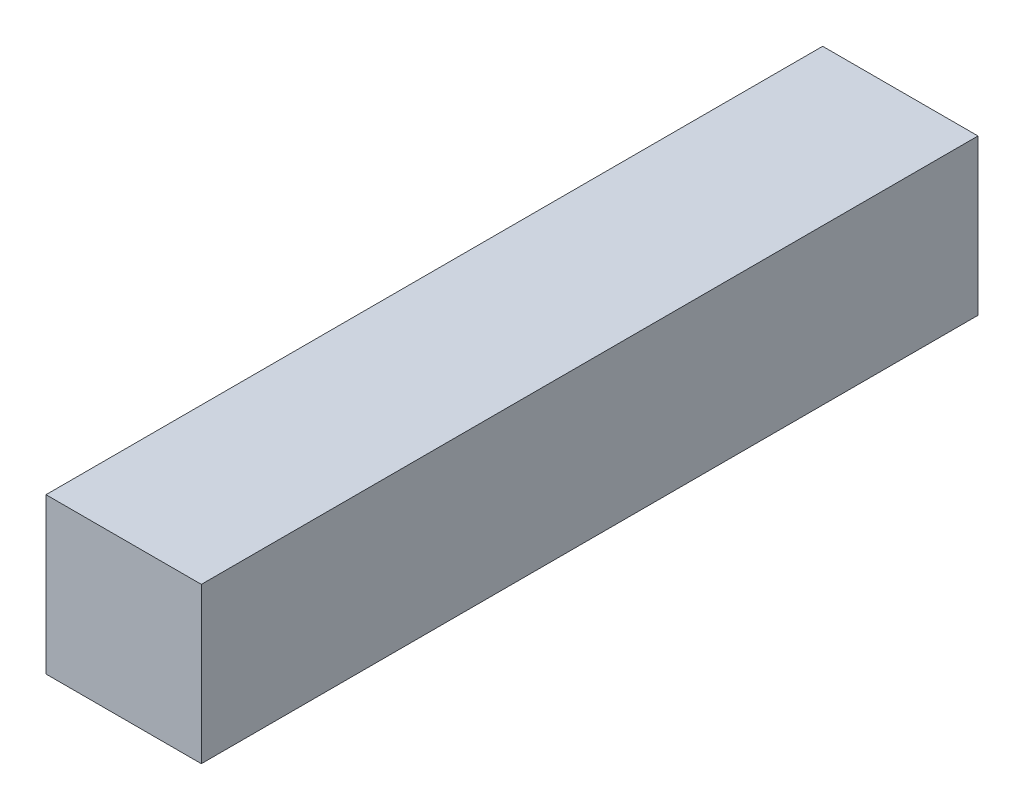
ISO-10303-21;
HEADER;
FILE_DESCRIPTION(('STEP AP214'),'2;1');
FILE_NAME('part.step','',(''),(''),'','','');
FILE_SCHEMA(('AUTOMOTIVE_DESIGN { 1 0 10303 214 1 1 1 1 }'));
ENDSEC;
DATA;
#1=APPLICATION_CONTEXT('core data for automotive mechanical design processes');
#2=APPLICATION_PROTOCOL_DEFINITION('international standard','automotive_design',2000,#1);
#3=PRODUCT_CONTEXT('',#1,'mechanical');
#4=PRODUCT('Part','Part','',(#3));
#5=PRODUCT_RELATED_PRODUCT_CATEGORY('part','',(#4));
#6=PRODUCT_DEFINITION_FORMATION('','',#4);
#7=PRODUCT_DEFINITION_CONTEXT('part definition',#1,'design');
#8=PRODUCT_DEFINITION('design','',#6,#7);
#9=PRODUCT_DEFINITION_SHAPE('','',#8);
#10=(LENGTH_UNIT() NAMED_UNIT(*) SI_UNIT(.MILLI.,.METRE.));
#11=(NAMED_UNIT(*) PLANE_ANGLE_UNIT() SI_UNIT($,.RADIAN.));
#12=(NAMED_UNIT(*) SI_UNIT($,.STERADIAN.) SOLID_ANGLE_UNIT());
#13=UNCERTAINTY_MEASURE_WITH_UNIT(LENGTH_MEASURE(1.E-05),#10,'distance_accuracy_value','');
#14=(GEOMETRIC_REPRESENTATION_CONTEXT(3) GLOBAL_UNCERTAINTY_ASSIGNED_CONTEXT((#13)) GLOBAL_UNIT_ASSIGNED_CONTEXT((#10,
#11,#12)) REPRESENTATION_CONTEXT('',''));
#15=CARTESIAN_POINT('',(0.,0.,0.));
#16=DIRECTION('',(0.,0.,1.));
#17=DIRECTION('',(1.,0.,0.));
#18=AXIS2_PLACEMENT_3D('',#15,#16,#17);
#19=CARTESIAN_POINT('',(0.,0.,-200000.));
#20=DIRECTION('',(-1.,0.,0.));
#21=DIRECTION('',(0.,0.,1.));
#22=AXIS2_PLACEMENT_3D('',#19,#20,#21);
#23=PLANE('',#22);
#24=DIRECTION('',(0.,-1.,0.));
#25=VECTOR('',#24,1.);
#26=CARTESIAN_POINT('',(0.,0.,0.));
#27=LINE('',#26,#25);
#28=CARTESIAN_POINT('',(0.,40000.,0.));
#29=VERTEX_POINT('',#28);
#30=CARTESIAN_POINT('',(0.,0.,0.));
#31=VERTEX_POINT('',#30);
#32=EDGE_CURVE('E104',#29,#31,#27,.T.);
#33=ORIENTED_EDGE('',*,*,#32,.F.);
#34=DIRECTION('',(0.,0.,1.));
#35=VECTOR('',#34,1.);
#36=CARTESIAN_POINT('',(0.,40000.,-200000.));
#37=LINE('',#36,#35);
#38=CARTESIAN_POINT('',(0.,40000.,-200000.));
#39=VERTEX_POINT('',#38);
#40=EDGE_CURVE('E11',#39,#29,#37,.T.);
#41=ORIENTED_EDGE('',*,*,#40,.F.);
#42=DIRECTION('',(0.,-1.,0.));
#43=VECTOR('',#42,1.);
#44=CARTESIAN_POINT('',(0.,0.,-200000.));
#45=LINE('',#44,#43);
#46=CARTESIAN_POINT('',(0.,0.,-200000.));
#47=VERTEX_POINT('',#46);
#48=EDGE_CURVE('E97',#39,#47,#45,.T.);
#49=ORIENTED_EDGE('',*,*,#48,.T.);
#50=DIRECTION('',(0.,0.,1.));
#51=VECTOR('',#50,1.);
#52=CARTESIAN_POINT('',(0.,0.,-200000.));
#53=LINE('',#52,#51);
#54=EDGE_CURVE('E42',#47,#31,#53,.T.);
#55=ORIENTED_EDGE('',*,*,#54,.T.);
#56=EDGE_LOOP('',(#33,#41,#49,#55));
#57=FACE_BOUND('',#56,.T.);
#58=ADVANCED_FACE('F41',(#57),#23,.T.);
#59=CARTESIAN_POINT('',(0.,40000.,-200000.));
#60=DIRECTION('',(0.,1.,0.));
#61=DIRECTION('',(0.,0.,1.));
#62=AXIS2_PLACEMENT_3D('',#59,#60,#61);
#63=PLANE('',#62);
#64=DIRECTION('',(-1.,0.,0.));
#65=VECTOR('',#64,1.);
#66=CARTESIAN_POINT('',(0.,40000.,0.));
#67=LINE('',#66,#65);
#68=CARTESIAN_POINT('',(40000.,40000.,0.));
#69=VERTEX_POINT('',#68);
#70=EDGE_CURVE('E101',#69,#29,#67,.T.);
#71=ORIENTED_EDGE('',*,*,#70,.F.);
#72=DIRECTION('',(0.,0.,1.));
#73=VECTOR('',#72,1.);
#74=CARTESIAN_POINT('',(40000.,40000.,-200000.));
#75=LINE('',#74,#73);
#76=CARTESIAN_POINT('',(40000.,40000.,-200000.));
#77=VERTEX_POINT('',#76);
#78=EDGE_CURVE('E49',#77,#69,#75,.T.);
#79=ORIENTED_EDGE('',*,*,#78,.F.);
#80=DIRECTION('',(-1.,0.,0.));
#81=VECTOR('',#80,1.);
#82=CARTESIAN_POINT('',(0.,40000.,-200000.));
#83=LINE('',#82,#81);
#84=EDGE_CURVE('E96',#77,#39,#83,.T.);
#85=ORIENTED_EDGE('',*,*,#84,.T.);
#86=ORIENTED_EDGE('',*,*,#40,.T.);
#87=EDGE_LOOP('',(#71,#79,#85,#86));
#88=FACE_BOUND('',#87,.T.);
#89=ADVANCED_FACE('F113',(#88),#63,.T.);
#90=CARTESIAN_POINT('',(40000.,0.,-200000.));
#91=DIRECTION('',(1.,0.,0.));
#92=DIRECTION('',(0.,0.,-1.));
#93=AXIS2_PLACEMENT_3D('',#90,#91,#92);
#94=PLANE('',#93);
#95=DIRECTION('',(0.,1.,0.));
#96=VECTOR('',#95,1.);
#97=CARTESIAN_POINT('',(40000.,0.,0.));
#98=LINE('',#97,#96);
#99=CARTESIAN_POINT('',(40000.,0.,0.));
#100=VERTEX_POINT('',#99);
#101=EDGE_CURVE('E93',#100,#69,#98,.T.);
#102=ORIENTED_EDGE('',*,*,#101,.F.);
#103=DIRECTION('',(0.,0.,1.));
#104=VECTOR('',#103,1.);
#105=CARTESIAN_POINT('',(40000.,0.,-200000.));
#106=LINE('',#105,#104);
#107=CARTESIAN_POINT('',(40000.,0.,-200000.));
#108=VERTEX_POINT('',#107);
#109=EDGE_CURVE('E88',#108,#100,#106,.T.);
#110=ORIENTED_EDGE('',*,*,#109,.F.);
#111=DIRECTION('',(0.,1.,0.));
#112=VECTOR('',#111,1.);
#113=CARTESIAN_POINT('',(40000.,0.,-200000.));
#114=LINE('',#113,#112);
#115=EDGE_CURVE('E90',#108,#77,#114,.T.);
#116=ORIENTED_EDGE('',*,*,#115,.T.);
#117=ORIENTED_EDGE('',*,*,#78,.T.);
#118=EDGE_LOOP('',(#102,#110,#116,#117));
#119=FACE_BOUND('',#118,.T.);
#120=ADVANCED_FACE('F86',(#119),#94,.T.);
#121=CARTESIAN_POINT('',(0.,0.,-200000.));
#122=DIRECTION('',(0.,-1.,0.));
#123=DIRECTION('',(0.,0.,-1.));
#124=AXIS2_PLACEMENT_3D('',#121,#122,#123);
#125=PLANE('',#124);
#126=DIRECTION('',(1.,0.,0.));
#127=VECTOR('',#126,1.);
#128=CARTESIAN_POINT('',(0.,0.,0.));
#129=LINE('',#128,#127);
#130=EDGE_CURVE('E107',#31,#100,#129,.T.);
#131=ORIENTED_EDGE('',*,*,#130,.F.);
#132=ORIENTED_EDGE('',*,*,#54,.F.);
#133=DIRECTION('',(1.,0.,0.));
#134=VECTOR('',#133,1.);
#135=CARTESIAN_POINT('',(0.,0.,-200000.));
#136=LINE('',#135,#134);
#137=EDGE_CURVE('E92',#47,#108,#136,.T.);
#138=ORIENTED_EDGE('',*,*,#137,.T.);
#139=ORIENTED_EDGE('',*,*,#109,.T.);
#140=EDGE_LOOP('',(#131,#132,#138,#139));
#141=FACE_BOUND('',#140,.T.);
#142=ADVANCED_FACE('F98',(#141),#125,.T.);
#143=CARTESIAN_POINT('',(0.,0.,-200000.));
#144=DIRECTION('',(0.,0.,-1.));
#145=DIRECTION('',(-1.,0.,0.));
#146=AXIS2_PLACEMENT_3D('',#143,#144,#145);
#147=PLANE('',#146);
#148=ORIENTED_EDGE('',*,*,#48,.F.);
#149=ORIENTED_EDGE('',*,*,#84,.F.);
#150=ORIENTED_EDGE('',*,*,#115,.F.);
#151=ORIENTED_EDGE('',*,*,#137,.F.);
#152=EDGE_LOOP('',(#148,#149,#150,#151));
#153=FACE_BOUND('',#152,.T.);
#154=ADVANCED_FACE('F94',(#153),#147,.T.);
#155=CARTESIAN_POINT('',(0.,0.,0.));
#156=DIRECTION('',(0.,0.,-1.));
#157=DIRECTION('',(-1.,0.,0.));
#158=AXIS2_PLACEMENT_3D('',#155,#156,#157);
#159=PLANE('',#158);
#160=ORIENTED_EDGE('',*,*,#32,.T.);
#161=ORIENTED_EDGE('',*,*,#130,.T.);
#162=ORIENTED_EDGE('',*,*,#101,.T.);
#163=ORIENTED_EDGE('',*,*,#70,.T.);
#164=EDGE_LOOP('',(#160,#161,#162,#163));
#165=FACE_BOUND('',#164,.T.);
#166=ADVANCED_FACE('F111',(#165),#159,.F.);
#167=CLOSED_SHELL('',(#58,#89,#120,#142,#154,#166));
#168=MANIFOLD_SOLID_BREP('B2',#167);
#169=ADVANCED_BREP_SHAPE_REPRESENTATION('',(#18,#168),#14);
#170=SHAPE_DEFINITION_REPRESENTATION(#9,#169);
ENDSEC;
END-ISO-10303-21;
